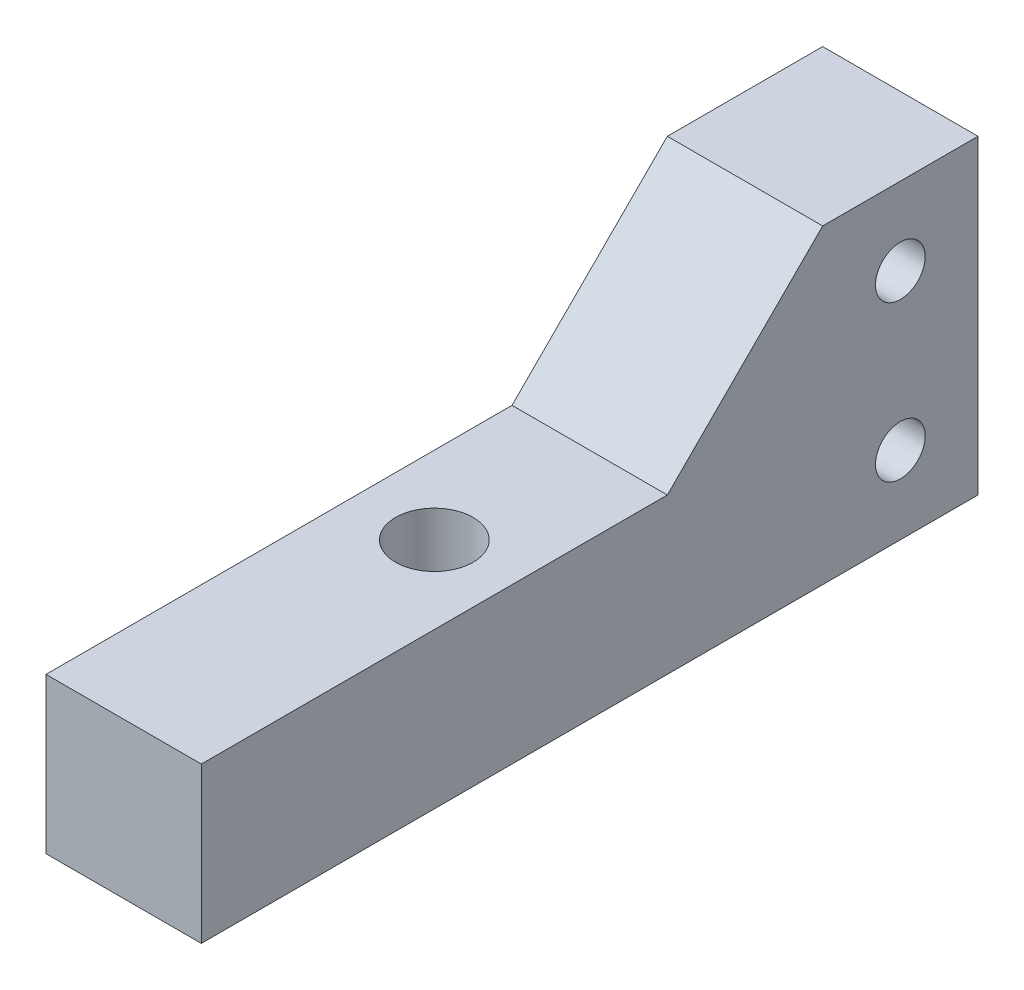
ISO-10303-21;
HEADER;
FILE_DESCRIPTION(('STEP AP214'),'2;1');
FILE_NAME('part.step','',(''),(''),'','','');
FILE_SCHEMA(('AUTOMOTIVE_DESIGN { 1 0 10303 214 1 1 1 1 }'));
ENDSEC;
DATA;
#1=APPLICATION_CONTEXT('core data for automotive mechanical design processes');
#2=APPLICATION_PROTOCOL_DEFINITION('international standard','automotive_design',2000,#1);
#3=PRODUCT_CONTEXT('',#1,'mechanical');
#4=PRODUCT('Part','Part','',(#3));
#5=PRODUCT_RELATED_PRODUCT_CATEGORY('part','',(#4));
#6=PRODUCT_DEFINITION_FORMATION('','',#4);
#7=PRODUCT_DEFINITION_CONTEXT('part definition',#1,'design');
#8=PRODUCT_DEFINITION('design','',#6,#7);
#9=PRODUCT_DEFINITION_SHAPE('','',#8);
#10=(LENGTH_UNIT() NAMED_UNIT(*) SI_UNIT(.MILLI.,.METRE.));
#11=(NAMED_UNIT(*) PLANE_ANGLE_UNIT() SI_UNIT($,.RADIAN.));
#12=(NAMED_UNIT(*) SI_UNIT($,.STERADIAN.) SOLID_ANGLE_UNIT());
#13=UNCERTAINTY_MEASURE_WITH_UNIT(LENGTH_MEASURE(1.E-05),#10,'distance_accuracy_value','');
#14=(GEOMETRIC_REPRESENTATION_CONTEXT(3) GLOBAL_UNCERTAINTY_ASSIGNED_CONTEXT((#13)) GLOBAL_UNIT_ASSIGNED_CONTEXT((#10,
#11,#12)) REPRESENTATION_CONTEXT('',''));
#15=CARTESIAN_POINT('',(0.,0.,0.));
#16=DIRECTION('',(0.,0.,1.));
#17=DIRECTION('',(1.,0.,0.));
#18=AXIS2_PLACEMENT_3D('',#15,#16,#17);
#19=CARTESIAN_POINT('',(37.8641031645975,-32.,72.7251189199662));
#20=DIRECTION('',(1.,0.,0.));
#21=DIRECTION('',(0.,0.,-1.));
#22=AXIS2_PLACEMENT_3D('',#19,#20,#21);
#23=PLANE('',#22);
#24=DIRECTION('',(0.,1.,0.));
#25=VECTOR('',#24,1.);
#26=CARTESIAN_POINT('',(37.8641031645975,236.,22.7151189199662));
#27=LINE('',#26,#25);
#28=CARTESIAN_POINT('',(37.8641031645975,-52.,22.7151189199662));
#29=VERTEX_POINT('',#28);
#30=CARTESIAN_POINT('',(37.8641031645975,-32.,22.7151189199662));
#31=VERTEX_POINT('',#30);
#32=EDGE_CURVE('E92',#29,#31,#27,.T.);
#33=ORIENTED_EDGE('',*,*,#32,.F.);
#34=DIRECTION('',(0.,0.,-1.));
#35=VECTOR('',#34,1.);
#36=CARTESIAN_POINT('',(37.8641031645975,-52.,22.7151189199662));
#37=LINE('',#36,#35);
#38=CARTESIAN_POINT('',(37.8641031645975,-52.,72.7151189199662));
#39=VERTEX_POINT('',#38);
#40=EDGE_CURVE('E120',#39,#29,#37,.T.);
#41=ORIENTED_EDGE('',*,*,#40,.F.);
#42=DIRECTION('',(0.,-1.,0.));
#43=VECTOR('',#42,1.);
#44=CARTESIAN_POINT('',(37.8641031645975,-52.,72.7151189199662));
#45=LINE('',#44,#43);
#46=CARTESIAN_POINT('',(37.8641031645975,-42.,72.7151189199662));
#47=VERTEX_POINT('',#46);
#48=EDGE_CURVE('E130',#47,#39,#45,.T.);
#49=ORIENTED_EDGE('',*,*,#48,.F.);
#50=DIRECTION('',(0.,0.,1.));
#51=VECTOR('',#50,1.);
#52=CARTESIAN_POINT('',(37.8641031645975,-42.,72.7151189199662));
#53=LINE('',#52,#51);
#54=CARTESIAN_POINT('',(37.8641031645975,-42.,42.715118919966));
#55=VERTEX_POINT('',#54);
#56=EDGE_CURVE('E128',#55,#47,#53,.T.);
#57=ORIENTED_EDGE('',*,*,#56,.F.);
#58=DIRECTION('',(0.,-0.707106781186554,0.707106781186541));
#59=VECTOR('',#58,1.);
#60=CARTESIAN_POINT('',(37.8641031645975,-32.,32.7151189199662));
#61=LINE('',#60,#59);
#62=CARTESIAN_POINT('',(37.8641031645975,-32.,32.7151189199662));
#63=VERTEX_POINT('',#62);
#64=EDGE_CURVE('E105',#63,#55,#61,.T.);
#65=ORIENTED_EDGE('',*,*,#64,.F.);
#66=DIRECTION('',(0.,0.,-1.));
#67=VECTOR('',#66,1.);
#68=CARTESIAN_POINT('',(37.8641031645975,-32.,46.8572545436971));
#69=LINE('',#68,#67);
#70=EDGE_CURVE('E100',#63,#31,#69,.T.);
#71=ORIENTED_EDGE('',*,*,#70,.T.);
#72=EDGE_LOOP('',(#33,#41,#49,#57,#65,#71));
#73=FACE_BOUND('',#72,.T.);
#74=CARTESIAN_POINT('',(37.8641031645975,-37.,27.7151189199662));
#75=DIRECTION('',(1.,0.,0.));
#76=DIRECTION('',(0.,0.,-1.));
#77=AXIS2_PLACEMENT_3D('',#74,#75,#76);
#78=CIRCLE('',#77,1.6);
#79=CARTESIAN_POINT('',(37.8641031645975,-37.,26.1151189199662));
#80=VERTEX_POINT('',#79);
#81=EDGE_CURVE('E146',#80,#80,#78,.F.);
#82=ORIENTED_EDGE('',*,*,#81,.F.);
#83=EDGE_LOOP('',(#82));
#84=FACE_BOUND('',#83,.T.);
#85=CARTESIAN_POINT('',(37.8641031645975,-47.,27.7151189199662));
#86=DIRECTION('',(1.,0.,0.));
#87=DIRECTION('',(0.,0.,-1.));
#88=AXIS2_PLACEMENT_3D('',#85,#86,#87);
#89=CIRCLE('',#88,1.6);
#90=CARTESIAN_POINT('',(37.8641031645975,-47.,26.1151189199662));
#91=VERTEX_POINT('',#90);
#92=EDGE_CURVE('E99',#91,#91,#89,.F.);
#93=ORIENTED_EDGE('',*,*,#92,.F.);
#94=EDGE_LOOP('',(#93));
#95=FACE_BOUND('',#94,.T.);
#96=ADVANCED_FACE('F38',(#73,#84,#95),#23,.F.);
#97=CARTESIAN_POINT('',(42.8641031645975,-47.,52.7151189199662));
#98=DIRECTION('',(0.,-1.,0.));
#99=DIRECTION('',(0.,0.,-1.));
#100=AXIS2_PLACEMENT_3D('',#97,#98,#99);
#101=PLANE('',#100);
#102=CARTESIAN_POINT('',(42.8641031645975,-47.,52.7151189199662));
#103=DIRECTION('',(0.,-1.,0.));
#104=DIRECTION('',(0.,0.,-1.));
#105=AXIS2_PLACEMENT_3D('',#102,#103,#104);
#106=CIRCLE('',#105,2.5);
#107=CARTESIAN_POINT('',(42.8641031645975,-47.,50.2151189199662));
#108=VERTEX_POINT('',#107);
#109=EDGE_CURVE('E141',#108,#108,#106,.F.);
#110=ORIENTED_EDGE('',*,*,#109,.T.);
#111=EDGE_LOOP('',(#110));
#112=FACE_BOUND('',#111,.T.);
#113=ADVANCED_FACE('F157',(#112),#101,.F.);
#114=CARTESIAN_POINT('',(42.8641031645975,261.,52.7151189199662));
#115=DIRECTION('',(0.,-1.,0.));
#116=DIRECTION('',(0.,0.,-1.));
#117=AXIS2_PLACEMENT_3D('',#114,#115,#116);
#118=CYLINDRICAL_SURFACE('',#117,2.5);
#119=CARTESIAN_POINT('',(42.8641031645975,-42.,52.7151189199662));
#120=DIRECTION('',(0.,-1.,0.));
#121=DIRECTION('',(0.,0.,-1.));
#122=AXIS2_PLACEMENT_3D('',#119,#120,#121);
#123=CIRCLE('',#122,2.5);
#124=CARTESIAN_POINT('',(42.8641031645975,-42.,50.2151189199662));
#125=VERTEX_POINT('',#124);
#126=EDGE_CURVE('E131',#125,#125,#123,.T.);
#127=ORIENTED_EDGE('',*,*,#126,.F.);
#128=EDGE_LOOP('',(#127));
#129=FACE_BOUND('',#128,.T.);
#130=ORIENTED_EDGE('',*,*,#109,.F.);
#131=EDGE_LOOP('',(#130));
#132=FACE_BOUND('',#131,.T.);
#133=ADVANCED_FACE('F165',(#129,#132),#118,.F.);
#134=CARTESIAN_POINT('',(37.8641031645975,236.,22.7151189199662));
#135=DIRECTION('',(0.,0.,1.));
#136=DIRECTION('',(1.,0.,0.));
#137=AXIS2_PLACEMENT_3D('',#134,#135,#136);
#138=PLANE('',#137);
#139=DIRECTION('',(-1.,0.,0.));
#140=VECTOR('',#139,1.);
#141=CARTESIAN_POINT('',(37.8641031645975,-52.,22.7151189199662));
#142=LINE('',#141,#140);
#143=CARTESIAN_POINT('',(47.8641031645975,-52.,22.7151189199662));
#144=VERTEX_POINT('',#143);
#145=EDGE_CURVE('E42',#144,#29,#142,.T.);
#146=ORIENTED_EDGE('',*,*,#145,.T.);
#147=ORIENTED_EDGE('',*,*,#32,.T.);
#148=DIRECTION('',(1.,0.,0.));
#149=VECTOR('',#148,1.);
#150=CARTESIAN_POINT('',(37.8641031645975,-32.,22.7151189199662));
#151=LINE('',#150,#149);
#152=CARTESIAN_POINT('',(47.8641031645975,-32.,22.7151189199662));
#153=VERTEX_POINT('',#152);
#154=EDGE_CURVE('E96',#31,#153,#151,.T.);
#155=ORIENTED_EDGE('',*,*,#154,.T.);
#156=DIRECTION('',(0.,1.,0.));
#157=VECTOR('',#156,1.);
#158=CARTESIAN_POINT('',(47.8641031645975,-42.,22.7151189199662));
#159=LINE('',#158,#157);
#160=EDGE_CURVE('E118',#144,#153,#159,.T.);
#161=ORIENTED_EDGE('',*,*,#160,.F.);
#162=EDGE_LOOP('',(#146,#147,#155,#161));
#163=FACE_BOUND('',#162,.T.);
#164=ADVANCED_FACE('F40',(#163),#138,.F.);
#165=CARTESIAN_POINT('',(47.8641031645976,194.,0.));
#166=DIRECTION('',(-1.,0.,0.));
#167=DIRECTION('',(0.,0.,-1.));
#168=AXIS2_PLACEMENT_3D('',#165,#166,#167);
#169=PLANE('',#168);
#170=CARTESIAN_POINT('',(47.8641031645976,-37.,27.7151189199662));
#171=DIRECTION('',(-1.,0.,0.));
#172=DIRECTION('',(0.,0.,1.));
#173=AXIS2_PLACEMENT_3D('',#170,#171,#172);
#174=CIRCLE('',#173,1.6);
#175=CARTESIAN_POINT('',(47.8641031645976,-37.,29.3151189199662));
#176=VERTEX_POINT('',#175);
#177=EDGE_CURVE('E47',#176,#176,#174,.T.);
#178=ORIENTED_EDGE('',*,*,#177,.T.);
#179=EDGE_LOOP('',(#178));
#180=FACE_BOUND('',#179,.T.);
#181=CARTESIAN_POINT('',(47.8641031645976,-47.,27.7151189199662));
#182=DIRECTION('',(-1.,0.,0.));
#183=DIRECTION('',(0.,0.,1.));
#184=AXIS2_PLACEMENT_3D('',#181,#182,#183);
#185=CIRCLE('',#184,1.6);
#186=CARTESIAN_POINT('',(47.8641031645976,-47.,29.3151189199662));
#187=VERTEX_POINT('',#186);
#188=EDGE_CURVE('E11',#187,#187,#185,.T.);
#189=ORIENTED_EDGE('',*,*,#188,.T.);
#190=EDGE_LOOP('',(#189));
#191=FACE_BOUND('',#190,.T.);
#192=DIRECTION('',(0.,-0.707106781186554,0.707106781186541));
#193=VECTOR('',#192,1.);
#194=CARTESIAN_POINT('',(47.8641031645975,-32.,32.7151189199662));
#195=LINE('',#194,#193);
#196=CARTESIAN_POINT('',(47.8641031645975,-32.,32.7151189199662));
#197=VERTEX_POINT('',#196);
#198=CARTESIAN_POINT('',(47.8641031645975,-42.,42.715118919966));
#199=VERTEX_POINT('',#198);
#200=EDGE_CURVE('E149',#197,#199,#195,.T.);
#201=ORIENTED_EDGE('',*,*,#200,.T.);
#202=DIRECTION('',(0.,0.,1.));
#203=VECTOR('',#202,1.);
#204=CARTESIAN_POINT('',(47.8641031645975,-42.,72.7151189199662));
#205=LINE('',#204,#203);
#206=CARTESIAN_POINT('',(47.8641031645975,-42.,72.7151189199662));
#207=VERTEX_POINT('',#206);
#208=EDGE_CURVE('E60',#199,#207,#205,.T.);
#209=ORIENTED_EDGE('',*,*,#208,.T.);
#210=DIRECTION('',(0.,-1.,0.));
#211=VECTOR('',#210,1.);
#212=CARTESIAN_POINT('',(47.8641031645975,-52.,72.7151189199662));
#213=LINE('',#212,#211);
#214=CARTESIAN_POINT('',(47.8641031645975,-52.,72.7151189199662));
#215=VERTEX_POINT('',#214);
#216=EDGE_CURVE('E122',#207,#215,#213,.T.);
#217=ORIENTED_EDGE('',*,*,#216,.T.);
#218=DIRECTION('',(0.,0.,-1.));
#219=VECTOR('',#218,1.);
#220=CARTESIAN_POINT('',(47.8641031645975,-52.,22.7151189199662));
#221=LINE('',#220,#219);
#222=EDGE_CURVE('E124',#215,#144,#221,.T.);
#223=ORIENTED_EDGE('',*,*,#222,.T.);
#224=ORIENTED_EDGE('',*,*,#160,.T.);
#225=DIRECTION('',(0.,0.,-1.));
#226=VECTOR('',#225,1.);
#227=CARTESIAN_POINT('',(47.8641031645975,-32.,46.8572545436971));
#228=LINE('',#227,#226);
#229=EDGE_CURVE('E111',#197,#153,#228,.T.);
#230=ORIENTED_EDGE('',*,*,#229,.F.);
#231=EDGE_LOOP('',(#201,#209,#217,#223,#224,#230));
#232=FACE_BOUND('',#231,.T.);
#233=ADVANCED_FACE('F182',(#180,#191,#232),#169,.F.);
#234=CARTESIAN_POINT('',(47.8641031645976,-37.,27.7151189199662));
#235=DIRECTION('',(-1.,0.,0.));
#236=DIRECTION('',(0.,0.,1.));
#237=AXIS2_PLACEMENT_3D('',#234,#235,#236);
#238=CYLINDRICAL_SURFACE('',#237,1.6);
#239=ORIENTED_EDGE('',*,*,#81,.T.);
#240=EDGE_LOOP('',(#239));
#241=FACE_BOUND('',#240,.T.);
#242=ORIENTED_EDGE('',*,*,#177,.F.);
#243=EDGE_LOOP('',(#242));
#244=FACE_BOUND('',#243,.T.);
#245=ADVANCED_FACE('F193',(#241,#244),#238,.F.);
#246=CARTESIAN_POINT('',(47.8641031645976,-47.,27.7151189199662));
#247=DIRECTION('',(-1.,0.,0.));
#248=DIRECTION('',(0.,0.,1.));
#249=AXIS2_PLACEMENT_3D('',#246,#247,#248);
#250=CYLINDRICAL_SURFACE('',#249,1.6);
#251=ORIENTED_EDGE('',*,*,#92,.T.);
#252=EDGE_LOOP('',(#251));
#253=FACE_BOUND('',#252,.T.);
#254=ORIENTED_EDGE('',*,*,#188,.F.);
#255=EDGE_LOOP('',(#254));
#256=FACE_BOUND('',#255,.T.);
#257=ADVANCED_FACE('F153',(#253,#256),#250,.F.);
#258=CARTESIAN_POINT('',(47.8641031645975,-42.,72.7151189199662));
#259=DIRECTION('',(0.,-1.,0.));
#260=DIRECTION('',(0.,0.,-1.));
#261=AXIS2_PLACEMENT_3D('',#258,#259,#260);
#262=PLANE('',#261);
#263=ORIENTED_EDGE('',*,*,#126,.T.);
#264=EDGE_LOOP('',(#263));
#265=FACE_BOUND('',#264,.T.);
#266=ORIENTED_EDGE('',*,*,#208,.F.);
#267=DIRECTION('',(1.,0.,0.));
#268=VECTOR('',#267,1.);
#269=CARTESIAN_POINT('',(23.7219675408667,-42.,42.715118919966));
#270=LINE('',#269,#268);
#271=EDGE_CURVE('E55',#55,#199,#270,.T.);
#272=ORIENTED_EDGE('',*,*,#271,.F.);
#273=ORIENTED_EDGE('',*,*,#56,.T.);
#274=DIRECTION('',(-1.,0.,0.));
#275=VECTOR('',#274,1.);
#276=CARTESIAN_POINT('',(47.8641031645975,-42.,72.7151189199662));
#277=LINE('',#276,#275);
#278=EDGE_CURVE('E136',#207,#47,#277,.T.);
#279=ORIENTED_EDGE('',*,*,#278,.F.);
#280=EDGE_LOOP('',(#266,#272,#273,#279));
#281=FACE_BOUND('',#280,.T.);
#282=ADVANCED_FACE('F183',(#265,#281),#262,.F.);
#283=CARTESIAN_POINT('',(37.8641031645975,-32.,46.8572545436971));
#284=DIRECTION('',(0.,1.,0.));
#285=DIRECTION('',(0.,0.,1.));
#286=AXIS2_PLACEMENT_3D('',#283,#284,#285);
#287=PLANE('',#286);
#288=DIRECTION('',(-1.,0.,0.));
#289=VECTOR('',#288,1.);
#290=CARTESIAN_POINT('',(37.8641031645975,-32.,32.7151189199662));
#291=LINE('',#290,#289);
#292=EDGE_CURVE('E113',#197,#63,#291,.T.);
#293=ORIENTED_EDGE('',*,*,#292,.F.);
#294=ORIENTED_EDGE('',*,*,#229,.T.);
#295=ORIENTED_EDGE('',*,*,#154,.F.);
#296=ORIENTED_EDGE('',*,*,#70,.F.);
#297=EDGE_LOOP('',(#293,#294,#295,#296));
#298=FACE_BOUND('',#297,.T.);
#299=ADVANCED_FACE('F109',(#298),#287,.T.);
#300=CARTESIAN_POINT('',(23.7219675408667,-32.,32.7151189199662));
#301=DIRECTION('',(0.,0.707106781186541,0.707106781186554));
#302=DIRECTION('',(0.,-0.707106781186554,0.707106781186541));
#303=AXIS2_PLACEMENT_3D('',#300,#301,#302);
#304=PLANE('',#303);
#305=ORIENTED_EDGE('',*,*,#292,.T.);
#306=ORIENTED_EDGE('',*,*,#64,.T.);
#307=ORIENTED_EDGE('',*,*,#271,.T.);
#308=ORIENTED_EDGE('',*,*,#200,.F.);
#309=EDGE_LOOP('',(#305,#306,#307,#308));
#310=FACE_BOUND('',#309,.T.);
#311=ADVANCED_FACE('F178',(#310),#304,.T.);
#312=CARTESIAN_POINT('',(0.,-52.,0.));
#313=DIRECTION('',(0.,1.,0.));
#314=DIRECTION('',(0.,0.,1.));
#315=AXIS2_PLACEMENT_3D('',#312,#313,#314);
#316=PLANE('',#315);
#317=ORIENTED_EDGE('',*,*,#40,.T.);
#318=ORIENTED_EDGE('',*,*,#145,.F.);
#319=ORIENTED_EDGE('',*,*,#222,.F.);
#320=DIRECTION('',(-1.,0.,0.));
#321=VECTOR('',#320,1.);
#322=CARTESIAN_POINT('',(47.8641031645975,-52.,72.7151189199662));
#323=LINE('',#322,#321);
#324=EDGE_CURVE('E127',#215,#39,#323,.T.);
#325=ORIENTED_EDGE('',*,*,#324,.T.);
#326=EDGE_LOOP('',(#317,#318,#319,#325));
#327=FACE_BOUND('',#326,.T.);
#328=ADVANCED_FACE('F171',(#327),#316,.F.);
#329=CARTESIAN_POINT('',(47.8641031645975,-52.,72.7151189199662));
#330=DIRECTION('',(0.,0.,-1.));
#331=DIRECTION('',(-1.,0.,0.));
#332=AXIS2_PLACEMENT_3D('',#329,#330,#331);
#333=PLANE('',#332);
#334=ORIENTED_EDGE('',*,*,#48,.T.);
#335=ORIENTED_EDGE('',*,*,#324,.F.);
#336=ORIENTED_EDGE('',*,*,#216,.F.);
#337=ORIENTED_EDGE('',*,*,#278,.T.);
#338=EDGE_LOOP('',(#334,#335,#336,#337));
#339=FACE_BOUND('',#338,.T.);
#340=ADVANCED_FACE('F159',(#339),#333,.F.);
#341=CLOSED_SHELL('',(#96,#113,#133,#164,#233,#245,#257,#282,#299,#311,#328,#340));
#342=MANIFOLD_SOLID_BREP('B2',#341);
#343=ADVANCED_BREP_SHAPE_REPRESENTATION('',(#18,#342),#14);
#344=SHAPE_DEFINITION_REPRESENTATION(#9,#343);
ENDSEC;
END-ISO-10303-21;
